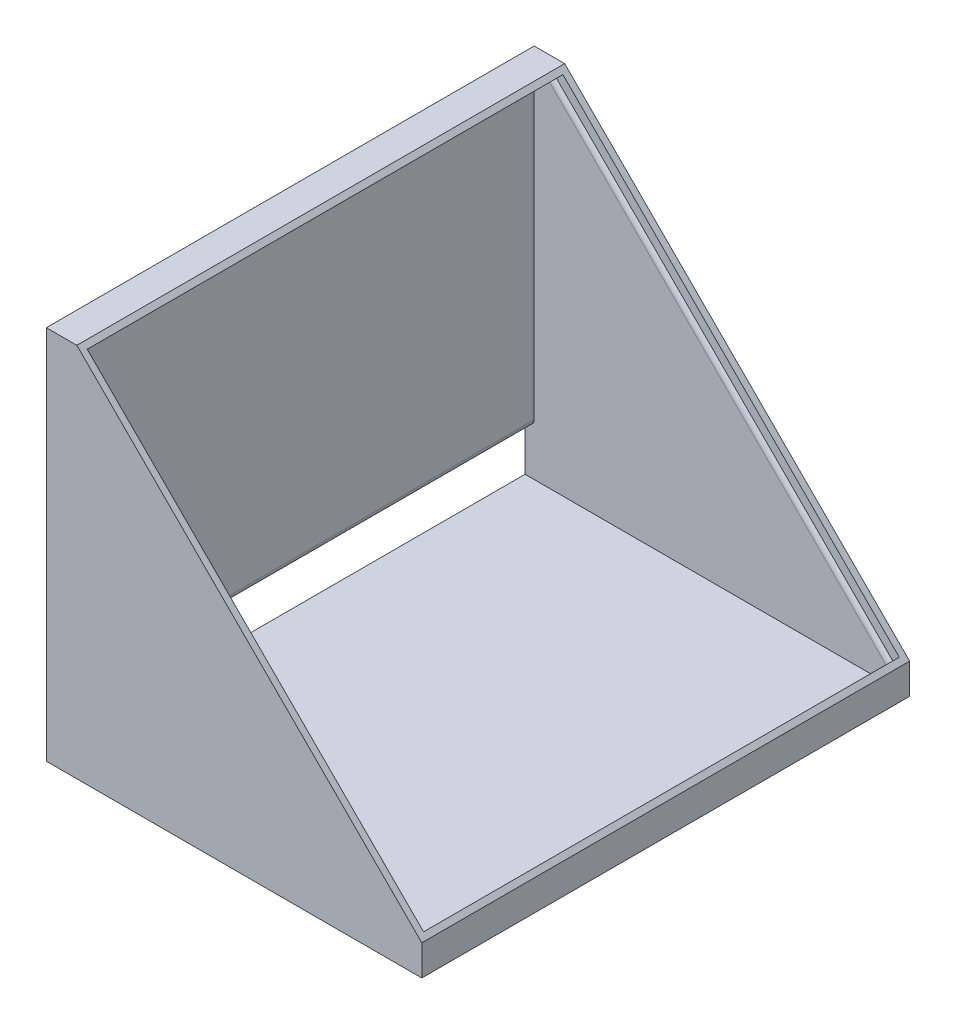
ISO-10303-21;
HEADER;
FILE_DESCRIPTION(('STEP AP214'),'2;1');
FILE_NAME('part.step','',(''),(''),'','','');
FILE_SCHEMA(('AUTOMOTIVE_DESIGN { 1 0 10303 214 1 1 1 1 }'));
ENDSEC;
DATA;
#1=APPLICATION_CONTEXT('core data for automotive mechanical design processes');
#2=APPLICATION_PROTOCOL_DEFINITION('international standard','automotive_design',2000,#1);
#3=PRODUCT_CONTEXT('',#1,'mechanical');
#4=PRODUCT('Part','Part','',(#3));
#5=PRODUCT_RELATED_PRODUCT_CATEGORY('part','',(#4));
#6=PRODUCT_DEFINITION_FORMATION('','',#4);
#7=PRODUCT_DEFINITION_CONTEXT('part definition',#1,'design');
#8=PRODUCT_DEFINITION('design','',#6,#7);
#9=PRODUCT_DEFINITION_SHAPE('','',#8);
#10=(LENGTH_UNIT() NAMED_UNIT(*) SI_UNIT(.MILLI.,.METRE.));
#11=(NAMED_UNIT(*) PLANE_ANGLE_UNIT() SI_UNIT($,.RADIAN.));
#12=(NAMED_UNIT(*) SI_UNIT($,.STERADIAN.) SOLID_ANGLE_UNIT());
#13=UNCERTAINTY_MEASURE_WITH_UNIT(LENGTH_MEASURE(1.E-05),#10,'distance_accuracy_value','');
#14=(GEOMETRIC_REPRESENTATION_CONTEXT(3) GLOBAL_UNCERTAINTY_ASSIGNED_CONTEXT((#13)) GLOBAL_UNIT_ASSIGNED_CONTEXT((#10,
#11,#12)) REPRESENTATION_CONTEXT('',''));
#15=CARTESIAN_POINT('',(0.,0.,0.));
#16=DIRECTION('',(0.,0.,1.));
#17=DIRECTION('',(1.,0.,0.));
#18=AXIS2_PLACEMENT_3D('',#15,#16,#17);
#19=CARTESIAN_POINT('',(60.0685424949238,0.,-78.5));
#20=DIRECTION('',(1.,0.,0.));
#21=DIRECTION('',(0.,0.,-1.));
#22=AXIS2_PLACEMENT_3D('',#19,#20,#21);
#23=PLANE('',#22);
#24=DIRECTION('',(0.,1.,0.));
#25=VECTOR('',#24,1.);
#26=CARTESIAN_POINT('',(60.0685424949238,0.,-1.5));
#27=LINE('',#26,#25);
#28=CARTESIAN_POINT('',(60.0685424949238,1.5,-1.5));
#29=VERTEX_POINT('',#28);
#30=CARTESIAN_POINT('',(60.0685424949238,3.15393478504878,-1.5));
#31=VERTEX_POINT('',#30);
#32=EDGE_CURVE('E203',#29,#31,#27,.T.);
#33=ORIENTED_EDGE('',*,*,#32,.T.);
#34=CARTESIAN_POINT('',(60.0685424949238,3.15393478504878,-0.5));
#35=DIRECTION('',(1.,0.,0.));
#36=DIRECTION('',(0.,1.,0.));
#37=AXIS2_PLACEMENT_3D('',#34,#35,#36);
#38=ELLIPSE('',#37,1.4142135623731,1.);
#39=CARTESIAN_POINT('',(60.0685424949238,4.37867965644037,-0.999999999999997));
#40=VERTEX_POINT('',#39);
#41=EDGE_CURVE('E347',#31,#40,#38,.T.);
#42=ORIENTED_EDGE('',*,*,#41,.T.);
#43=DIRECTION('',(0.,0.,1.));
#44=VECTOR('',#43,1.);
#45=CARTESIAN_POINT('',(60.0685424949238,4.37867965644036,-78.5));
#46=LINE('',#45,#44);
#47=CARTESIAN_POINT('',(60.0685424949238,4.37867965644037,-79.));
#48=VERTEX_POINT('',#47);
#49=EDGE_CURVE('E78',#48,#40,#46,.T.);
#50=ORIENTED_EDGE('',*,*,#49,.F.);
#51=CARTESIAN_POINT('',(60.0685424949238,3.15393478504877,-79.5));
#52=DIRECTION('',(1.,0.,0.));
#53=DIRECTION('',(0.,-1.,0.));
#54=AXIS2_PLACEMENT_3D('',#51,#52,#53);
#55=ELLIPSE('',#54,1.4142135623731,1.);
#56=CARTESIAN_POINT('',(60.0685424949238,3.15393478504877,-78.5));
#57=VERTEX_POINT('',#56);
#58=EDGE_CURVE('E340',#48,#57,#55,.T.);
#59=ORIENTED_EDGE('',*,*,#58,.T.);
#60=DIRECTION('',(0.,1.,0.));
#61=VECTOR('',#60,1.);
#62=CARTESIAN_POINT('',(60.0685424949238,0.,-78.5));
#63=LINE('',#62,#61);
#64=CARTESIAN_POINT('',(60.0685424949238,1.5,-78.5));
#65=VERTEX_POINT('',#64);
#66=EDGE_CURVE('E261',#65,#57,#63,.T.);
#67=ORIENTED_EDGE('',*,*,#66,.F.);
#68=DIRECTION('',(0.,0.,1.));
#69=VECTOR('',#68,1.);
#70=CARTESIAN_POINT('',(60.0685424949238,1.5,-78.5));
#71=LINE('',#70,#69);
#72=EDGE_CURVE('E271',#65,#29,#71,.T.);
#73=ORIENTED_EDGE('',*,*,#72,.T.);
#74=EDGE_LOOP('',(#33,#42,#50,#59,#67,#73));
#75=FACE_BOUND('',#74,.T.);
#76=ADVANCED_FACE('F63',(#75),#23,.F.);
#77=CARTESIAN_POINT('',(0.,1.5,-78.5));
#78=DIRECTION('',(0.,-1.,0.));
#79=DIRECTION('',(0.,0.,-1.));
#80=AXIS2_PLACEMENT_3D('',#77,#78,#79);
#81=PLANE('',#80);
#82=ORIENTED_EDGE('',*,*,#72,.F.);
#83=DIRECTION('',(1.,0.,0.));
#84=VECTOR('',#83,1.);
#85=CARTESIAN_POINT('',(0.,1.5,-78.5));
#86=LINE('',#85,#84);
#87=CARTESIAN_POINT('',(0.,1.50000000000001,-78.5));
#88=VERTEX_POINT('',#87);
#89=EDGE_CURVE('E212',#88,#65,#86,.T.);
#90=ORIENTED_EDGE('',*,*,#89,.F.);
#91=DIRECTION('',(0.,0.,1.));
#92=VECTOR('',#91,1.);
#93=CARTESIAN_POINT('',(0.,1.50000000000001,-78.5));
#94=LINE('',#93,#92);
#95=CARTESIAN_POINT('',(0.,1.50000000000002,-1.5));
#96=VERTEX_POINT('',#95);
#97=EDGE_CURVE('E210',#88,#96,#94,.T.);
#98=ORIENTED_EDGE('',*,*,#97,.T.);
#99=DIRECTION('',(1.,0.,0.));
#100=VECTOR('',#99,1.);
#101=CARTESIAN_POINT('',(0.,1.5,-1.5));
#102=LINE('',#101,#100);
#103=EDGE_CURVE('E194',#96,#29,#102,.T.);
#104=ORIENTED_EDGE('',*,*,#103,.T.);
#105=EDGE_LOOP('',(#82,#90,#98,#104));
#106=FACE_BOUND('',#105,.T.);
#107=ADVANCED_FACE('F211',(#106),#81,.F.);
#108=CARTESIAN_POINT('',(1.5,0.,-78.5));
#109=DIRECTION('',(-1.,0.,0.));
#110=DIRECTION('',(0.,0.,1.));
#111=AXIS2_PLACEMENT_3D('',#108,#109,#110);
#112=PLANE('',#111);
#113=DIRECTION('',(0.,-1.,0.));
#114=VECTOR('',#113,1.);
#115=CARTESIAN_POINT('',(1.5,0.,-1.5));
#116=LINE('',#115,#114);
#117=CARTESIAN_POINT('',(1.5,60.0685424949238,-1.5));
#118=VERTEX_POINT('',#117);
#119=CARTESIAN_POINT('',(1.5,10.,-1.5));
#120=VERTEX_POINT('',#119);
#121=EDGE_CURVE('E207',#118,#120,#116,.T.);
#122=ORIENTED_EDGE('',*,*,#121,.T.);
#123=DIRECTION('',(0.,0.,-1.));
#124=VECTOR('',#123,1.);
#125=CARTESIAN_POINT('',(1.5,10.,-78.5));
#126=LINE('',#125,#124);
#127=CARTESIAN_POINT('',(1.5,10.,-78.5));
#128=VERTEX_POINT('',#127);
#129=EDGE_CURVE('E310',#120,#128,#126,.T.);
#130=ORIENTED_EDGE('',*,*,#129,.T.);
#131=DIRECTION('',(0.,-1.,0.));
#132=VECTOR('',#131,1.);
#133=CARTESIAN_POINT('',(1.5,0.,-78.5));
#134=LINE('',#133,#132);
#135=CARTESIAN_POINT('',(1.5,60.0685424949238,-78.5));
#136=VERTEX_POINT('',#135);
#137=EDGE_CURVE('E257',#136,#128,#134,.T.);
#138=ORIENTED_EDGE('',*,*,#137,.F.);
#139=DIRECTION('',(0.,0.,1.));
#140=VECTOR('',#139,1.);
#141=CARTESIAN_POINT('',(1.5,60.0685424949238,-78.5));
#142=LINE('',#141,#140);
#143=EDGE_CURVE('E273',#136,#118,#142,.T.);
#144=ORIENTED_EDGE('',*,*,#143,.T.);
#145=EDGE_LOOP('',(#122,#130,#138,#144));
#146=FACE_BOUND('',#145,.T.);
#147=ADVANCED_FACE('F401',(#146),#112,.F.);
#148=CARTESIAN_POINT('',(0.,60.0685424949238,-78.5));
#149=DIRECTION('',(0.,1.,0.));
#150=DIRECTION('',(0.,0.,1.));
#151=AXIS2_PLACEMENT_3D('',#148,#149,#150);
#152=PLANE('',#151);
#153=DIRECTION('',(0.,0.,1.));
#154=VECTOR('',#153,1.);
#155=CARTESIAN_POINT('',(4.37867965644036,60.0685424949238,-78.5));
#156=LINE('',#155,#154);
#157=CARTESIAN_POINT('',(4.3786796564404,60.0685424949238,-79.));
#158=VERTEX_POINT('',#157);
#159=CARTESIAN_POINT('',(4.3786796564404,60.0685424949238,-1.));
#160=VERTEX_POINT('',#159);
#161=EDGE_CURVE('E264',#158,#160,#156,.T.);
#162=ORIENTED_EDGE('',*,*,#161,.T.);
#163=CARTESIAN_POINT('',(3.15393478504879,60.0685424949238,-0.5));
#164=DIRECTION('',(0.,1.,0.));
#165=DIRECTION('',(-1.,0.,0.));
#166=AXIS2_PLACEMENT_3D('',#163,#164,#165);
#167=ELLIPSE('',#166,1.41421356237309,1.);
#168=CARTESIAN_POINT('',(3.1539347850488,60.0685424949238,-1.5));
#169=VERTEX_POINT('',#168);
#170=EDGE_CURVE('E345',#160,#169,#167,.T.);
#171=ORIENTED_EDGE('',*,*,#170,.T.);
#172=DIRECTION('',(-1.,0.,0.));
#173=VECTOR('',#172,1.);
#174=CARTESIAN_POINT('',(0.,60.0685424949238,-1.5));
#175=LINE('',#174,#173);
#176=EDGE_CURVE('E249',#169,#118,#175,.T.);
#177=ORIENTED_EDGE('',*,*,#176,.T.);
#178=ORIENTED_EDGE('',*,*,#143,.F.);
#179=DIRECTION('',(-1.,0.,0.));
#180=VECTOR('',#179,1.);
#181=CARTESIAN_POINT('',(0.,60.0685424949238,-78.5));
#182=LINE('',#181,#180);
#183=CARTESIAN_POINT('',(3.15393478504879,60.0685424949238,-78.5));
#184=VERTEX_POINT('',#183);
#185=EDGE_CURVE('E255',#184,#136,#182,.T.);
#186=ORIENTED_EDGE('',*,*,#185,.F.);
#187=CARTESIAN_POINT('',(3.15393478504878,60.0685424949238,-79.5));
#188=DIRECTION('',(0.,1.,0.));
#189=DIRECTION('',(1.,0.,0.));
#190=AXIS2_PLACEMENT_3D('',#187,#188,#189);
#191=ELLIPSE('',#190,1.41421356237309,1.);
#192=EDGE_CURVE('E342',#184,#158,#191,.T.);
#193=ORIENTED_EDGE('',*,*,#192,.T.);
#194=EDGE_LOOP('',(#162,#171,#177,#178,#186,#193));
#195=FACE_BOUND('',#194,.T.);
#196=ADVANCED_FACE('F382',(#195),#152,.F.);
#197=CARTESIAN_POINT('',(0.,0.,-78.5));
#198=DIRECTION('',(0.,0.,1.));
#199=DIRECTION('',(1.,0.,0.));
#200=AXIS2_PLACEMENT_3D('',#197,#198,#199);
#201=PLANE('',#200);
#202=ORIENTED_EDGE('',*,*,#66,.T.);
#203=DIRECTION('',(-0.707106781186547,0.707106781186548,0.));
#204=VECTOR('',#203,1.);
#205=CARTESIAN_POINT('',(4.03407417371095,59.1884031062616,-78.5));
#206=LINE('',#205,#204);
#207=EDGE_CURVE('E329',#57,#184,#206,.T.);
#208=ORIENTED_EDGE('',*,*,#207,.T.);
#209=ORIENTED_EDGE('',*,*,#185,.T.);
#210=ORIENTED_EDGE('',*,*,#137,.T.);
#211=CARTESIAN_POINT('',(0.5,10.,-78.5));
#212=DIRECTION('',(0.,0.,1.));
#213=DIRECTION('',(1.,0.,0.));
#214=AXIS2_PLACEMENT_3D('',#211,#212,#213);
#215=CIRCLE('',#214,1.);
#216=CARTESIAN_POINT('',(0.5,9.00000000000001,-78.5));
#217=VERTEX_POINT('',#216);
#218=EDGE_CURVE('E322',#128,#217,#215,.F.);
#219=ORIENTED_EDGE('',*,*,#218,.T.);
#220=DIRECTION('',(-1.,0.,0.));
#221=VECTOR('',#220,1.);
#222=CARTESIAN_POINT('',(2.,9.00000000000001,-78.5));
#223=LINE('',#222,#221);
#224=CARTESIAN_POINT('',(0.,9.00000000000001,-78.5));
#225=VERTEX_POINT('',#224);
#226=EDGE_CURVE('E227',#217,#225,#223,.T.);
#227=ORIENTED_EDGE('',*,*,#226,.T.);
#228=DIRECTION('',(0.,-1.,0.));
#229=VECTOR('',#228,1.);
#230=CARTESIAN_POINT('',(0.,1.50000000000001,-78.5));
#231=LINE('',#230,#229);
#232=EDGE_CURVE('E216',#225,#88,#231,.T.);
#233=ORIENTED_EDGE('',*,*,#232,.T.);
#234=ORIENTED_EDGE('',*,*,#89,.T.);
#235=EDGE_LOOP('',(#202,#208,#209,#210,#219,#227,#233,#234));
#236=FACE_BOUND('',#235,.T.);
#237=ADVANCED_FACE('F389',(#236),#201,.T.);
#238=CARTESIAN_POINT('',(0.,0.,-1.5));
#239=DIRECTION('',(0.,0.,1.));
#240=DIRECTION('',(1.,0.,0.));
#241=AXIS2_PLACEMENT_3D('',#238,#239,#240);
#242=PLANE('',#241);
#243=ORIENTED_EDGE('',*,*,#176,.F.);
#244=DIRECTION('',(-0.707106781186547,0.707106781186548,0.));
#245=VECTOR('',#244,1.);
#246=CARTESIAN_POINT('',(31.6112386399863,31.6112386399863,-1.5));
#247=LINE('',#246,#245);
#248=EDGE_CURVE('E331',#169,#31,#247,.F.);
#249=ORIENTED_EDGE('',*,*,#248,.T.);
#250=ORIENTED_EDGE('',*,*,#32,.F.);
#251=ORIENTED_EDGE('',*,*,#103,.F.);
#252=DIRECTION('',(0.,1.,0.));
#253=VECTOR('',#252,1.);
#254=CARTESIAN_POINT('',(0.,1.50000000000002,-1.5));
#255=LINE('',#254,#253);
#256=CARTESIAN_POINT('',(0.,9.00000000000002,-1.5));
#257=VERTEX_POINT('',#256);
#258=EDGE_CURVE('E200',#96,#257,#255,.T.);
#259=ORIENTED_EDGE('',*,*,#258,.T.);
#260=DIRECTION('',(-1.,0.,0.));
#261=VECTOR('',#260,1.);
#262=CARTESIAN_POINT('',(2.,9.00000000000002,-1.5));
#263=LINE('',#262,#261);
#264=CARTESIAN_POINT('',(0.5,9.00000000000002,-1.5));
#265=VERTEX_POINT('',#264);
#266=EDGE_CURVE('E223',#265,#257,#263,.T.);
#267=ORIENTED_EDGE('',*,*,#266,.F.);
#268=CARTESIAN_POINT('',(0.5,10.,-1.5));
#269=DIRECTION('',(0.,0.,1.));
#270=DIRECTION('',(1.,0.,0.));
#271=AXIS2_PLACEMENT_3D('',#268,#269,#270);
#272=CIRCLE('',#271,1.);
#273=EDGE_CURVE('E324',#265,#120,#272,.T.);
#274=ORIENTED_EDGE('',*,*,#273,.T.);
#275=ORIENTED_EDGE('',*,*,#121,.F.);
#276=EDGE_LOOP('',(#243,#249,#250,#251,#259,#267,#274,#275));
#277=FACE_BOUND('',#276,.T.);
#278=ADVANCED_FACE('F197',(#277),#242,.F.);
#279=CARTESIAN_POINT('',(59.8007755419574,4.64644660940673,-1.));
#280=DIRECTION('',(0.,0.,1.));
#281=DIRECTION('',(1.,0.,0.));
#282=AXIS2_PLACEMENT_3D('',#279,#280,#281);
#283=PLANE('',#282);
#284=DIRECTION('',(0.707106781186547,-0.707106781186548,0.));
#285=VECTOR('',#284,1.);
#286=CARTESIAN_POINT('',(60.8614357137373,5.70710678118655,-1.));
#287=LINE('',#286,#285);
#288=CARTESIAN_POINT('',(5.70710678118657,60.8614357137373,-1.));
#289=VERTEX_POINT('',#288);
#290=CARTESIAN_POINT('',(60.8614357137373,5.70710678118655,-1.));
#291=VERTEX_POINT('',#290);
#292=EDGE_CURVE('E229',#289,#291,#287,.T.);
#293=ORIENTED_EDGE('',*,*,#292,.T.);
#294=DIRECTION('',(0.707106781186548,0.707106781186547,0.));
#295=VECTOR('',#294,1.);
#296=CARTESIAN_POINT('',(59.8007755419574,4.64644660940673,-1.));
#297=LINE('',#296,#295);
#298=CARTESIAN_POINT('',(60.3548337657385,5.20050483318783,-1.));
#299=VERTEX_POINT('',#298);
#300=EDGE_CURVE('E236',#299,#291,#297,.T.);
#301=ORIENTED_EDGE('',*,*,#300,.F.);
#302=CARTESIAN_POINT('',(61.0619405469251,4.49339805200128,-1.));
#303=DIRECTION('',(0.,0.,1.));
#304=DIRECTION('',(1.,0.,0.));
#305=AXIS2_PLACEMENT_3D('',#302,#303,#304);
#306=CIRCLE('',#305,1.);
#307=EDGE_CURVE('E12',#299,#40,#306,.T.);
#308=ORIENTED_EDGE('',*,*,#307,.T.);
#309=DIRECTION('',(0.707106781186547,-0.707106781186548,0.));
#310=VECTOR('',#309,1.);
#311=CARTESIAN_POINT('',(59.8007755419574,4.64644660940673,-1.));
#312=LINE('',#311,#310);
#313=EDGE_CURVE('E231',#160,#40,#312,.T.);
#314=ORIENTED_EDGE('',*,*,#313,.F.);
#315=CARTESIAN_POINT('',(4.49339805200129,61.0619405469251,-1.));
#316=DIRECTION('',(0.,0.,1.));
#317=DIRECTION('',(1.,0.,0.));
#318=AXIS2_PLACEMENT_3D('',#315,#316,#317);
#319=CIRCLE('',#318,1.);
#320=CARTESIAN_POINT('',(5.20050483318784,60.3548337657385,-1.));
#321=VERTEX_POINT('',#320);
#322=EDGE_CURVE('E335',#160,#321,#319,.T.);
#323=ORIENTED_EDGE('',*,*,#322,.T.);
#324=DIRECTION('',(0.707106781186548,0.707106781186547,0.));
#325=VECTOR('',#324,1.);
#326=CARTESIAN_POINT('',(4.64644660940674,59.8007755419574,-1.));
#327=LINE('',#326,#325);
#328=EDGE_CURVE('E247',#321,#289,#327,.T.);
#329=ORIENTED_EDGE('',*,*,#328,.T.);
#330=EDGE_LOOP('',(#293,#301,#308,#314,#323,#329));
#331=FACE_BOUND('',#330,.T.);
#332=ADVANCED_FACE('F359',(#331),#283,.F.);
#333=CARTESIAN_POINT('',(4.64644660940674,59.8007755419574,-1.));
#334=DIRECTION('',(-0.707106781186547,0.707106781186548,0.));
#335=DIRECTION('',(-0.707106781186548,-0.707106781186547,0.));
#336=AXIS2_PLACEMENT_3D('',#333,#334,#335);
#337=PLANE('',#336);
#338=ORIENTED_EDGE('',*,*,#328,.F.);
#339=DIRECTION('',(0.,0.,1.));
#340=VECTOR('',#339,1.);
#341=CARTESIAN_POINT('',(5.20050483318784,60.3548337657385,-1.));
#342=LINE('',#341,#340);
#343=CARTESIAN_POINT('',(5.20050483318784,60.3548337657385,-79.));
#344=VERTEX_POINT('',#343);
#345=EDGE_CURVE('E326',#321,#344,#342,.F.);
#346=ORIENTED_EDGE('',*,*,#345,.T.);
#347=DIRECTION('',(0.707106781186548,0.707106781186547,0.));
#348=VECTOR('',#347,1.);
#349=CARTESIAN_POINT('',(4.64644660940674,59.8007755419574,-79.));
#350=LINE('',#349,#348);
#351=CARTESIAN_POINT('',(5.70710678118657,60.8614357137373,-79.));
#352=VERTEX_POINT('',#351);
#353=EDGE_CURVE('E250',#344,#352,#350,.T.);
#354=ORIENTED_EDGE('',*,*,#353,.T.);
#355=DIRECTION('',(0.,0.,1.));
#356=VECTOR('',#355,1.);
#357=CARTESIAN_POINT('',(5.70710678118657,60.8614357137373,-1.));
#358=LINE('',#357,#356);
#359=EDGE_CURVE('E234',#352,#289,#358,.T.);
#360=ORIENTED_EDGE('',*,*,#359,.T.);
#361=EDGE_LOOP('',(#338,#346,#354,#360));
#362=FACE_BOUND('',#361,.T.);
#363=ADVANCED_FACE('F373',(#362),#337,.F.);
#364=CARTESIAN_POINT('',(59.8007755419574,4.64644660940673,-79.));
#365=DIRECTION('',(0.,0.,-1.));
#366=DIRECTION('',(-1.,0.,0.));
#367=AXIS2_PLACEMENT_3D('',#364,#365,#366);
#368=PLANE('',#367);
#369=DIRECTION('',(-0.707106781186547,0.707106781186548,0.));
#370=VECTOR('',#369,1.);
#371=CARTESIAN_POINT('',(60.8614357137373,5.70710678118655,-79.));
#372=LINE('',#371,#370);
#373=CARTESIAN_POINT('',(60.8614357137373,5.70710678118655,-79.));
#374=VERTEX_POINT('',#373);
#375=EDGE_CURVE('E242',#374,#352,#372,.T.);
#376=ORIENTED_EDGE('',*,*,#375,.T.);
#377=ORIENTED_EDGE('',*,*,#353,.F.);
#378=CARTESIAN_POINT('',(4.49339805200129,61.0619405469251,-79.));
#379=DIRECTION('',(0.,0.,-1.));
#380=DIRECTION('',(-1.,0.,0.));
#381=AXIS2_PLACEMENT_3D('',#378,#379,#380);
#382=CIRCLE('',#381,1.);
#383=EDGE_CURVE('E337',#344,#158,#382,.T.);
#384=ORIENTED_EDGE('',*,*,#383,.T.);
#385=DIRECTION('',(-0.707106781186547,0.707106781186548,0.));
#386=VECTOR('',#385,1.);
#387=CARTESIAN_POINT('',(59.8007755419574,4.64644660940673,-79.));
#388=LINE('',#387,#386);
#389=EDGE_CURVE('E233',#48,#158,#388,.T.);
#390=ORIENTED_EDGE('',*,*,#389,.F.);
#391=CARTESIAN_POINT('',(61.0619405469251,4.49339805200128,-79.));
#392=DIRECTION('',(0.,0.,-1.));
#393=DIRECTION('',(-1.,0.,0.));
#394=AXIS2_PLACEMENT_3D('',#391,#392,#393);
#395=CIRCLE('',#394,1.);
#396=CARTESIAN_POINT('',(60.3548337657385,5.20050483318783,-79.));
#397=VERTEX_POINT('',#396);
#398=EDGE_CURVE('E71',#48,#397,#395,.T.);
#399=ORIENTED_EDGE('',*,*,#398,.T.);
#400=DIRECTION('',(0.707106781186548,0.707106781186547,0.));
#401=VECTOR('',#400,1.);
#402=CARTESIAN_POINT('',(59.8007755419574,4.64644660940673,-79.));
#403=LINE('',#402,#401);
#404=EDGE_CURVE('E252',#397,#374,#403,.T.);
#405=ORIENTED_EDGE('',*,*,#404,.T.);
#406=EDGE_LOOP('',(#376,#377,#384,#390,#399,#405));
#407=FACE_BOUND('',#406,.T.);
#408=ADVANCED_FACE('F350',(#407),#368,.F.);
#409=CARTESIAN_POINT('',(59.8007755419574,4.64644660940673,-1.));
#410=DIRECTION('',(0.707106781186547,-0.707106781186548,0.));
#411=DIRECTION('',(0.707106781186548,0.707106781186547,0.));
#412=AXIS2_PLACEMENT_3D('',#409,#410,#411);
#413=PLANE('',#412);
#414=ORIENTED_EDGE('',*,*,#404,.F.);
#415=DIRECTION('',(0.,0.,-1.));
#416=VECTOR('',#415,1.);
#417=CARTESIAN_POINT('',(60.3548337657385,5.20050483318783,-1.));
#418=LINE('',#417,#416);
#419=EDGE_CURVE('E333',#397,#299,#418,.F.);
#420=ORIENTED_EDGE('',*,*,#419,.T.);
#421=ORIENTED_EDGE('',*,*,#300,.T.);
#422=DIRECTION('',(0.,0.,-1.));
#423=VECTOR('',#422,1.);
#424=CARTESIAN_POINT('',(60.8614357137373,5.70710678118655,-1.));
#425=LINE('',#424,#423);
#426=EDGE_CURVE('E239',#291,#374,#425,.T.);
#427=ORIENTED_EDGE('',*,*,#426,.T.);
#428=EDGE_LOOP('',(#414,#420,#421,#427));
#429=FACE_BOUND('',#428,.T.);
#430=ADVANCED_FACE('F354',(#429),#413,.F.);
#431=CARTESIAN_POINT('',(5.,61.5685424949238,-80.));
#432=DIRECTION('',(0.707106781186548,0.707106781186548,0.));
#433=DIRECTION('',(-0.707106781186548,0.707106781186548,0.));
#434=AXIS2_PLACEMENT_3D('',#431,#432,#433);
#435=PLANE('',#434);
#436=ORIENTED_EDGE('',*,*,#292,.F.);
#437=ORIENTED_EDGE('',*,*,#359,.F.);
#438=ORIENTED_EDGE('',*,*,#375,.F.);
#439=ORIENTED_EDGE('',*,*,#426,.F.);
#440=EDGE_LOOP('',(#436,#437,#438,#439));
#441=FACE_BOUND('',#440,.T.);
#442=DIRECTION('',(-0.707106781186548,0.707106781186548,0.));
#443=VECTOR('',#442,1.);
#444=CARTESIAN_POINT('',(5.,61.5685424949238,0.));
#445=LINE('',#444,#443);
#446=CARTESIAN_POINT('',(61.5685424949238,5.,0.));
#447=VERTEX_POINT('',#446);
#448=CARTESIAN_POINT('',(5.,61.5685424949238,0.));
#449=VERTEX_POINT('',#448);
#450=EDGE_CURVE('E270',#447,#449,#445,.T.);
#451=ORIENTED_EDGE('',*,*,#450,.F.);
#452=DIRECTION('',(0.,0.,1.));
#453=VECTOR('',#452,1.);
#454=CARTESIAN_POINT('',(61.5685424949238,5.,-80.));
#455=LINE('',#454,#453);
#456=CARTESIAN_POINT('',(61.5685424949238,5.,-80.));
#457=VERTEX_POINT('',#456);
#458=EDGE_CURVE('E308',#457,#447,#455,.T.);
#459=ORIENTED_EDGE('',*,*,#458,.F.);
#460=DIRECTION('',(-0.707106781186548,0.707106781186548,0.));
#461=VECTOR('',#460,1.);
#462=CARTESIAN_POINT('',(5.,61.5685424949238,-80.));
#463=LINE('',#462,#461);
#464=CARTESIAN_POINT('',(5.,61.5685424949238,-80.));
#465=VERTEX_POINT('',#464);
#466=EDGE_CURVE('E278',#457,#465,#463,.T.);
#467=ORIENTED_EDGE('',*,*,#466,.T.);
#468=DIRECTION('',(0.,0.,1.));
#469=VECTOR('',#468,1.);
#470=CARTESIAN_POINT('',(5.,61.5685424949238,-80.));
#471=LINE('',#470,#469);
#472=EDGE_CURVE('E294',#465,#449,#471,.T.);
#473=ORIENTED_EDGE('',*,*,#472,.T.);
#474=EDGE_LOOP('',(#451,#459,#467,#473));
#475=FACE_BOUND('',#474,.T.);
#476=ADVANCED_FACE('F378',(#441,#475),#435,.T.);
#477=CARTESIAN_POINT('',(61.5685424949238,5.,-80.));
#478=DIRECTION('',(1.,0.,0.));
#479=DIRECTION('',(0.,0.,-1.));
#480=AXIS2_PLACEMENT_3D('',#477,#478,#479);
#481=PLANE('',#480);
#482=DIRECTION('',(0.,1.,0.));
#483=VECTOR('',#482,1.);
#484=CARTESIAN_POINT('',(61.5685424949238,5.,0.));
#485=LINE('',#484,#483);
#486=CARTESIAN_POINT('',(61.5685424949238,0.,0.));
#487=VERTEX_POINT('',#486);
#488=EDGE_CURVE('E282',#487,#447,#485,.T.);
#489=ORIENTED_EDGE('',*,*,#488,.F.);
#490=DIRECTION('',(0.,0.,1.));
#491=VECTOR('',#490,1.);
#492=CARTESIAN_POINT('',(61.5685424949238,0.,-80.));
#493=LINE('',#492,#491);
#494=CARTESIAN_POINT('',(61.5685424949238,0.,-80.));
#495=VERTEX_POINT('',#494);
#496=EDGE_CURVE('E311',#495,#487,#493,.T.);
#497=ORIENTED_EDGE('',*,*,#496,.F.);
#498=DIRECTION('',(0.,1.,0.));
#499=VECTOR('',#498,1.);
#500=CARTESIAN_POINT('',(61.5685424949238,5.,-80.));
#501=LINE('',#500,#499);
#502=EDGE_CURVE('E291',#495,#457,#501,.T.);
#503=ORIENTED_EDGE('',*,*,#502,.T.);
#504=ORIENTED_EDGE('',*,*,#458,.T.);
#505=EDGE_LOOP('',(#489,#497,#503,#504));
#506=FACE_BOUND('',#505,.T.);
#507=ADVANCED_FACE('F444',(#506),#481,.T.);
#508=CARTESIAN_POINT('',(61.5685424949238,0.,-80.));
#509=DIRECTION('',(0.,-1.,0.));
#510=DIRECTION('',(0.,0.,-1.));
#511=AXIS2_PLACEMENT_3D('',#508,#509,#510);
#512=PLANE('',#511);
#513=DIRECTION('',(1.,0.,0.));
#514=VECTOR('',#513,1.);
#515=CARTESIAN_POINT('',(61.5685424949238,0.,0.));
#516=LINE('',#515,#514);
#517=CARTESIAN_POINT('',(0.,0.,0.));
#518=VERTEX_POINT('',#517);
#519=EDGE_CURVE('E303',#518,#487,#516,.T.);
#520=ORIENTED_EDGE('',*,*,#519,.F.);
#521=DIRECTION('',(0.,0.,1.));
#522=VECTOR('',#521,1.);
#523=CARTESIAN_POINT('',(0.,0.,-80.));
#524=LINE('',#523,#522);
#525=CARTESIAN_POINT('',(0.,0.,-80.));
#526=VERTEX_POINT('',#525);
#527=EDGE_CURVE('E313',#526,#518,#524,.T.);
#528=ORIENTED_EDGE('',*,*,#527,.F.);
#529=DIRECTION('',(1.,0.,0.));
#530=VECTOR('',#529,1.);
#531=CARTESIAN_POINT('',(61.5685424949238,0.,-80.));
#532=LINE('',#531,#530);
#533=EDGE_CURVE('E288',#526,#495,#532,.T.);
#534=ORIENTED_EDGE('',*,*,#533,.T.);
#535=ORIENTED_EDGE('',*,*,#496,.T.);
#536=EDGE_LOOP('',(#520,#528,#534,#535));
#537=FACE_BOUND('',#536,.T.);
#538=ADVANCED_FACE('F447',(#537),#512,.T.);
#539=CARTESIAN_POINT('',(0.,61.5685424949238,-80.));
#540=DIRECTION('',(-1.,0.,0.));
#541=DIRECTION('',(0.,0.,1.));
#542=AXIS2_PLACEMENT_3D('',#539,#540,#541);
#543=PLANE('',#542);
#544=ORIENTED_EDGE('',*,*,#232,.F.);
#545=DIRECTION('',(0.,0.,-1.));
#546=VECTOR('',#545,1.);
#547=CARTESIAN_POINT('',(0.,9.00000000000001,-78.5));
#548=LINE('',#547,#546);
#549=EDGE_CURVE('E221',#257,#225,#548,.T.);
#550=ORIENTED_EDGE('',*,*,#549,.F.);
#551=ORIENTED_EDGE('',*,*,#258,.F.);
#552=ORIENTED_EDGE('',*,*,#97,.F.);
#553=EDGE_LOOP('',(#544,#550,#551,#552));
#554=FACE_BOUND('',#553,.T.);
#555=DIRECTION('',(0.,-1.,0.));
#556=VECTOR('',#555,1.);
#557=CARTESIAN_POINT('',(0.,61.5685424949238,0.));
#558=LINE('',#557,#556);
#559=CARTESIAN_POINT('',(0.,61.5685424949238,0.));
#560=VERTEX_POINT('',#559);
#561=EDGE_CURVE('E300',#560,#518,#558,.T.);
#562=ORIENTED_EDGE('',*,*,#561,.F.);
#563=DIRECTION('',(0.,0.,1.));
#564=VECTOR('',#563,1.);
#565=CARTESIAN_POINT('',(0.,61.5685424949238,-80.));
#566=LINE('',#565,#564);
#567=CARTESIAN_POINT('',(0.,61.5685424949238,-80.));
#568=VERTEX_POINT('',#567);
#569=EDGE_CURVE('E315',#568,#560,#566,.T.);
#570=ORIENTED_EDGE('',*,*,#569,.F.);
#571=DIRECTION('',(0.,-1.,0.));
#572=VECTOR('',#571,1.);
#573=CARTESIAN_POINT('',(0.,61.5685424949238,-80.));
#574=LINE('',#573,#572);
#575=EDGE_CURVE('E285',#568,#526,#574,.T.);
#576=ORIENTED_EDGE('',*,*,#575,.T.);
#577=ORIENTED_EDGE('',*,*,#527,.T.);
#578=EDGE_LOOP('',(#562,#570,#576,#577));
#579=FACE_BOUND('',#578,.T.);
#580=ADVANCED_FACE('F218',(#554,#579),#543,.T.);
#581=CARTESIAN_POINT('',(5.,61.5685424949238,-80.));
#582=DIRECTION('',(0.,1.,0.));
#583=DIRECTION('',(0.,0.,1.));
#584=AXIS2_PLACEMENT_3D('',#581,#582,#583);
#585=PLANE('',#584);
#586=DIRECTION('',(-1.,0.,0.));
#587=VECTOR('',#586,1.);
#588=CARTESIAN_POINT('',(5.,61.5685424949238,0.));
#589=LINE('',#588,#587);
#590=EDGE_CURVE('E297',#449,#560,#589,.T.);
#591=ORIENTED_EDGE('',*,*,#590,.F.);
#592=ORIENTED_EDGE('',*,*,#472,.F.);
#593=DIRECTION('',(-1.,0.,0.));
#594=VECTOR('',#593,1.);
#595=CARTESIAN_POINT('',(5.,61.5685424949238,-80.));
#596=LINE('',#595,#594);
#597=EDGE_CURVE('E281',#465,#568,#596,.T.);
#598=ORIENTED_EDGE('',*,*,#597,.T.);
#599=ORIENTED_EDGE('',*,*,#569,.T.);
#600=EDGE_LOOP('',(#591,#592,#598,#599));
#601=FACE_BOUND('',#600,.T.);
#602=ADVANCED_FACE('F440',(#601),#585,.T.);
#603=CARTESIAN_POINT('',(0.,0.,-80.));
#604=DIRECTION('',(0.,0.,1.));
#605=DIRECTION('',(1.,0.,0.));
#606=AXIS2_PLACEMENT_3D('',#603,#604,#605);
#607=PLANE('',#606);
#608=ORIENTED_EDGE('',*,*,#466,.F.);
#609=ORIENTED_EDGE('',*,*,#502,.F.);
#610=ORIENTED_EDGE('',*,*,#533,.F.);
#611=ORIENTED_EDGE('',*,*,#575,.F.);
#612=ORIENTED_EDGE('',*,*,#597,.F.);
#613=EDGE_LOOP('',(#608,#609,#610,#611,#612));
#614=FACE_BOUND('',#613,.T.);
#615=ADVANCED_FACE('F434',(#614),#607,.F.);
#616=CARTESIAN_POINT('',(0.,0.,0.));
#617=DIRECTION('',(0.,0.,1.));
#618=DIRECTION('',(1.,0.,0.));
#619=AXIS2_PLACEMENT_3D('',#616,#617,#618);
#620=PLANE('',#619);
#621=ORIENTED_EDGE('',*,*,#450,.T.);
#622=ORIENTED_EDGE('',*,*,#590,.T.);
#623=ORIENTED_EDGE('',*,*,#561,.T.);
#624=ORIENTED_EDGE('',*,*,#519,.T.);
#625=ORIENTED_EDGE('',*,*,#488,.T.);
#626=EDGE_LOOP('',(#621,#622,#623,#624,#625));
#627=FACE_BOUND('',#626,.T.);
#628=ADVANCED_FACE('F428',(#627),#620,.T.);
#629=CARTESIAN_POINT('',(2.,9.00000000000001,-78.5));
#630=DIRECTION('',(0.,1.,0.));
#631=DIRECTION('',(0.,0.,1.));
#632=AXIS2_PLACEMENT_3D('',#629,#630,#631);
#633=PLANE('',#632);
#634=ORIENTED_EDGE('',*,*,#226,.F.);
#635=DIRECTION('',(0.,0.,-1.));
#636=VECTOR('',#635,1.);
#637=CARTESIAN_POINT('',(0.5,9.00000000000001,-78.5));
#638=LINE('',#637,#636);
#639=EDGE_CURVE('E320',#217,#265,#638,.F.);
#640=ORIENTED_EDGE('',*,*,#639,.T.);
#641=ORIENTED_EDGE('',*,*,#266,.T.);
#642=ORIENTED_EDGE('',*,*,#549,.T.);
#643=EDGE_LOOP('',(#634,#640,#641,#642));
#644=FACE_BOUND('',#643,.T.);
#645=ADVANCED_FACE('F393',(#644),#633,.F.);
#646=CARTESIAN_POINT('',(0.5,10.,-78.5));
#647=DIRECTION('',(0.,0.,-1.));
#648=DIRECTION('',(0.,1.,0.));
#649=AXIS2_PLACEMENT_3D('',#646,#647,#648);
#650=CYLINDRICAL_SURFACE('',#649,1.);
#651=ORIENTED_EDGE('',*,*,#273,.F.);
#652=ORIENTED_EDGE('',*,*,#639,.F.);
#653=ORIENTED_EDGE('',*,*,#218,.F.);
#654=ORIENTED_EDGE('',*,*,#129,.F.);
#655=EDGE_LOOP('',(#651,#652,#653,#654));
#656=FACE_BOUND('',#655,.T.);
#657=ADVANCED_FACE('F398',(#656),#650,.T.);
#658=CARTESIAN_POINT('',(61.0619405469251,4.49339805200128,-78.5));
#659=DIRECTION('',(0.,0.,-1.));
#660=DIRECTION('',(-1.,0.,0.));
#661=AXIS2_PLACEMENT_3D('',#658,#659,#660);
#662=CYLINDRICAL_SURFACE('',#661,1.);
#663=ORIENTED_EDGE('',*,*,#419,.F.);
#664=ORIENTED_EDGE('',*,*,#398,.F.);
#665=ORIENTED_EDGE('',*,*,#49,.T.);
#666=ORIENTED_EDGE('',*,*,#307,.F.);
#667=EDGE_LOOP('',(#663,#664,#665,#666));
#668=FACE_BOUND('',#667,.T.);
#669=ADVANCED_FACE('F65',(#668),#662,.T.);
#670=CARTESIAN_POINT('',(31.6112386399863,31.6112386399863,-79.5));
#671=DIRECTION('',(0.707106781186547,-0.707106781186548,0.));
#672=DIRECTION('',(0.707106781186548,0.707106781186547,0.));
#673=AXIS2_PLACEMENT_3D('',#670,#671,#672);
#674=CYLINDRICAL_SURFACE('',#673,1.);
#675=ORIENTED_EDGE('',*,*,#389,.T.);
#676=ORIENTED_EDGE('',*,*,#192,.F.);
#677=ORIENTED_EDGE('',*,*,#207,.F.);
#678=ORIENTED_EDGE('',*,*,#58,.F.);
#679=EDGE_LOOP('',(#675,#676,#677,#678));
#680=FACE_BOUND('',#679,.T.);
#681=ADVANCED_FACE('F386',(#680),#674,.T.);
#682=CARTESIAN_POINT('',(31.6112386399863,31.6112386399863,-0.5));
#683=DIRECTION('',(-0.707106781186547,0.707106781186548,0.));
#684=DIRECTION('',(-0.707106781186548,-0.707106781186547,0.));
#685=AXIS2_PLACEMENT_3D('',#682,#683,#684);
#686=CYLINDRICAL_SURFACE('',#685,1.);
#687=ORIENTED_EDGE('',*,*,#248,.F.);
#688=ORIENTED_EDGE('',*,*,#170,.F.);
#689=ORIENTED_EDGE('',*,*,#313,.T.);
#690=ORIENTED_EDGE('',*,*,#41,.F.);
#691=EDGE_LOOP('',(#687,#688,#689,#690));
#692=FACE_BOUND('',#691,.T.);
#693=ADVANCED_FACE('F363',(#692),#686,.T.);
#694=CARTESIAN_POINT('',(4.49339805200129,61.0619405469251,-78.5));
#695=DIRECTION('',(0.,0.,1.));
#696=DIRECTION('',(1.,0.,0.));
#697=AXIS2_PLACEMENT_3D('',#694,#695,#696);
#698=CYLINDRICAL_SURFACE('',#697,1.);
#699=ORIENTED_EDGE('',*,*,#383,.F.);
#700=ORIENTED_EDGE('',*,*,#345,.F.);
#701=ORIENTED_EDGE('',*,*,#322,.F.);
#702=ORIENTED_EDGE('',*,*,#161,.F.);
#703=EDGE_LOOP('',(#699,#700,#701,#702));
#704=FACE_BOUND('',#703,.T.);
#705=ADVANCED_FACE('F370',(#704),#698,.T.);
#706=CLOSED_SHELL('',(#76,#107,#147,#196,#237,#278,#332,#363,#408,#430,#476,#507,#538,#580,#602,
#615,#628,#645,#657,#669,#681,#693,#705));
#707=MANIFOLD_SOLID_BREP('B2',#706);
#708=ADVANCED_BREP_SHAPE_REPRESENTATION('',(#18,#707),#14);
#709=SHAPE_DEFINITION_REPRESENTATION(#9,#708);
ENDSEC;
END-ISO-10303-21;
